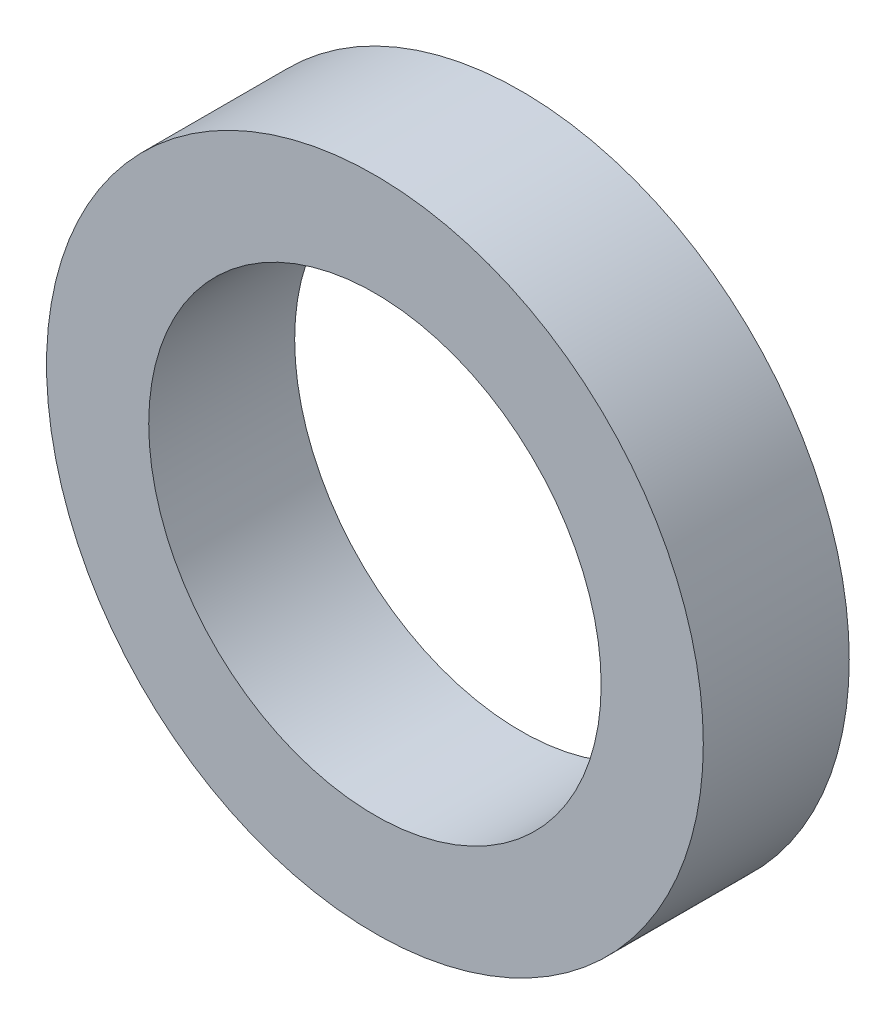
ISO-10303-21;
HEADER;
FILE_DESCRIPTION(('STEP AP214'),'2;1');
FILE_NAME('part.step','',(''),(''),'','','');
FILE_SCHEMA(('AUTOMOTIVE_DESIGN { 1 0 10303 214 1 1 1 1 }'));
ENDSEC;
DATA;
#1=APPLICATION_CONTEXT('core data for automotive mechanical design processes');
#2=APPLICATION_PROTOCOL_DEFINITION('international standard','automotive_design',2000,#1);
#3=PRODUCT_CONTEXT('',#1,'mechanical');
#4=PRODUCT('Part','Part','',(#3));
#5=PRODUCT_RELATED_PRODUCT_CATEGORY('part','',(#4));
#6=PRODUCT_DEFINITION_FORMATION('','',#4);
#7=PRODUCT_DEFINITION_CONTEXT('part definition',#1,'design');
#8=PRODUCT_DEFINITION('design','',#6,#7);
#9=PRODUCT_DEFINITION_SHAPE('','',#8);
#10=(LENGTH_UNIT() NAMED_UNIT(*) SI_UNIT(.MILLI.,.METRE.));
#11=(NAMED_UNIT(*) PLANE_ANGLE_UNIT() SI_UNIT($,.RADIAN.));
#12=(NAMED_UNIT(*) SI_UNIT($,.STERADIAN.) SOLID_ANGLE_UNIT());
#13=UNCERTAINTY_MEASURE_WITH_UNIT(LENGTH_MEASURE(1.E-05),#10,'distance_accuracy_value','');
#14=(GEOMETRIC_REPRESENTATION_CONTEXT(3) GLOBAL_UNCERTAINTY_ASSIGNED_CONTEXT((#13)) GLOBAL_UNIT_ASSIGNED_CONTEXT((#10,
#11,#12)) REPRESENTATION_CONTEXT('',''));
#15=CARTESIAN_POINT('',(0.,0.,0.));
#16=DIRECTION('',(0.,0.,1.));
#17=DIRECTION('',(1.,0.,0.));
#18=AXIS2_PLACEMENT_3D('',#15,#16,#17);
#19=CARTESIAN_POINT('',(0.,0.,2.));
#20=DIRECTION('',(0.,0.,1.));
#21=DIRECTION('',(1.,0.,0.));
#22=AXIS2_PLACEMENT_3D('',#19,#20,#21);
#23=PLANE('',#22);
#24=CARTESIAN_POINT('',(0.,0.,2.));
#25=DIRECTION('',(0.,0.,1.));
#26=DIRECTION('',(1.,0.,0.));
#27=AXIS2_PLACEMENT_3D('',#24,#25,#26);
#28=CIRCLE('',#27,4.5);
#29=CARTESIAN_POINT('',(4.5,0.,2.));
#30=VERTEX_POINT('',#29);
#31=EDGE_CURVE('E10',#30,#30,#28,.T.);
#32=ORIENTED_EDGE('',*,*,#31,.T.);
#33=EDGE_LOOP('',(#32));
#34=FACE_BOUND('',#33,.T.);
#35=CARTESIAN_POINT('',(0.,0.,2.));
#36=DIRECTION('',(0.,0.,1.));
#37=DIRECTION('',(1.,0.,0.));
#38=AXIS2_PLACEMENT_3D('',#35,#36,#37);
#39=CIRCLE('',#38,3.1);
#40=CARTESIAN_POINT('',(3.1,0.,2.));
#41=VERTEX_POINT('',#40);
#42=EDGE_CURVE('E48',#41,#41,#39,.T.);
#43=ORIENTED_EDGE('',*,*,#42,.F.);
#44=EDGE_LOOP('',(#43));
#45=FACE_BOUND('',#44,.T.);
#46=ADVANCED_FACE('F37',(#34,#45),#23,.T.);
#47=CARTESIAN_POINT('',(0.,0.,0.));
#48=DIRECTION('',(0.,0.,1.));
#49=DIRECTION('',(1.,0.,0.));
#50=AXIS2_PLACEMENT_3D('',#47,#48,#49);
#51=PLANE('',#50);
#52=CARTESIAN_POINT('',(0.,0.,0.));
#53=DIRECTION('',(0.,0.,1.));
#54=DIRECTION('',(1.,0.,0.));
#55=AXIS2_PLACEMENT_3D('',#52,#53,#54);
#56=CIRCLE('',#55,4.5);
#57=CARTESIAN_POINT('',(4.5,0.,0.));
#58=VERTEX_POINT('',#57);
#59=EDGE_CURVE('E41',#58,#58,#56,.T.);
#60=ORIENTED_EDGE('',*,*,#59,.F.);
#61=EDGE_LOOP('',(#60));
#62=FACE_BOUND('',#61,.T.);
#63=CARTESIAN_POINT('',(0.,0.,0.));
#64=DIRECTION('',(0.,0.,1.));
#65=DIRECTION('',(1.,0.,0.));
#66=AXIS2_PLACEMENT_3D('',#63,#64,#65);
#67=CIRCLE('',#66,3.1);
#68=CARTESIAN_POINT('',(3.1,0.,0.));
#69=VERTEX_POINT('',#68);
#70=EDGE_CURVE('E50',#69,#69,#67,.T.);
#71=ORIENTED_EDGE('',*,*,#70,.T.);
#72=EDGE_LOOP('',(#71));
#73=FACE_BOUND('',#72,.T.);
#74=ADVANCED_FACE('F60',(#62,#73),#51,.F.);
#75=CARTESIAN_POINT('',(0.,0.,2.));
#76=DIRECTION('',(0.,0.,-1.));
#77=DIRECTION('',(-1.,0.,0.));
#78=AXIS2_PLACEMENT_3D('',#75,#76,#77);
#79=CYLINDRICAL_SURFACE('',#78,4.5);
#80=ORIENTED_EDGE('',*,*,#31,.F.);
#81=EDGE_LOOP('',(#80));
#82=FACE_BOUND('',#81,.T.);
#83=ORIENTED_EDGE('',*,*,#59,.T.);
#84=EDGE_LOOP('',(#83));
#85=FACE_BOUND('',#84,.T.);
#86=ADVANCED_FACE('F39',(#82,#85),#79,.T.);
#87=CARTESIAN_POINT('',(0.,0.,2.));
#88=DIRECTION('',(0.,0.,-1.));
#89=DIRECTION('',(-1.,0.,0.));
#90=AXIS2_PLACEMENT_3D('',#87,#88,#89);
#91=CYLINDRICAL_SURFACE('',#90,3.1);
#92=ORIENTED_EDGE('',*,*,#42,.T.);
#93=EDGE_LOOP('',(#92));
#94=FACE_BOUND('',#93,.T.);
#95=ORIENTED_EDGE('',*,*,#70,.F.);
#96=EDGE_LOOP('',(#95));
#97=FACE_BOUND('',#96,.T.);
#98=ADVANCED_FACE('F56',(#94,#97),#91,.F.);
#99=CLOSED_SHELL('',(#46,#74,#86,#98));
#100=MANIFOLD_SOLID_BREP('B2',#99);
#101=ADVANCED_BREP_SHAPE_REPRESENTATION('',(#18,#100),#14);
#102=SHAPE_DEFINITION_REPRESENTATION(#9,#101);
ENDSEC;
END-ISO-10303-21;
